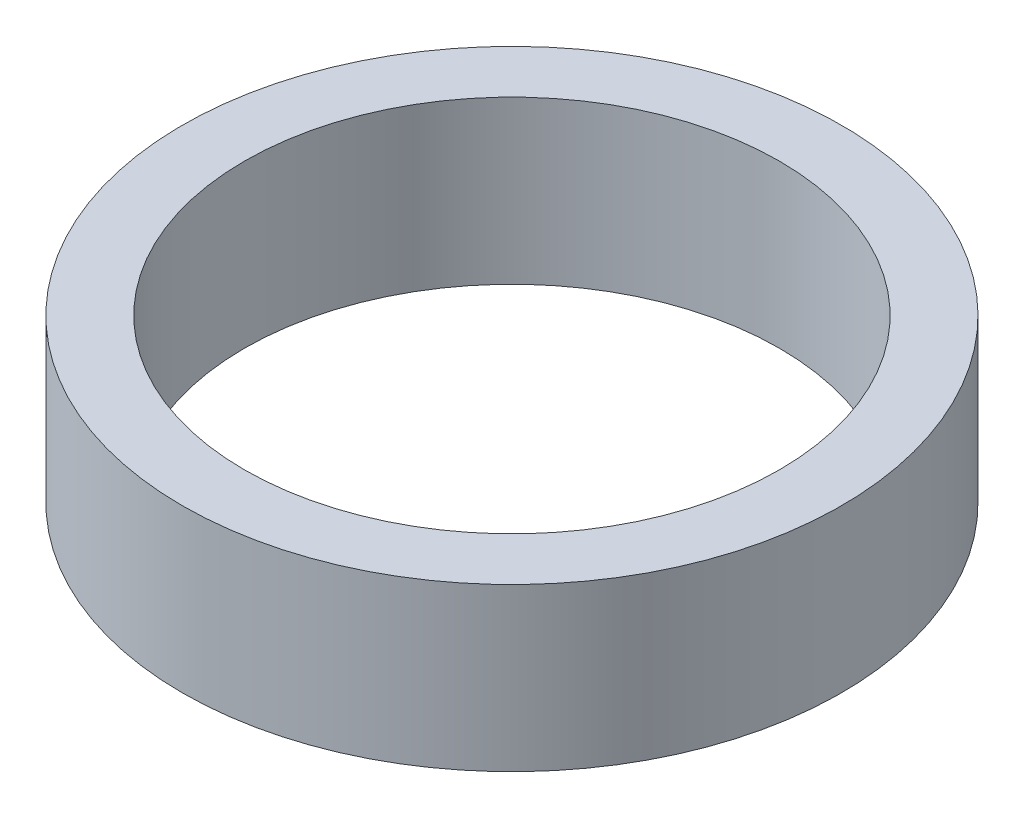
ISO-10303-21;
HEADER;
FILE_DESCRIPTION(('STEP AP214'),'2;1');
FILE_NAME('part.step','',(''),(''),'','','');
FILE_SCHEMA(('AUTOMOTIVE_DESIGN { 1 0 10303 214 1 1 1 1 }'));
ENDSEC;
DATA;
#1=APPLICATION_CONTEXT('core data for automotive mechanical design processes');
#2=APPLICATION_PROTOCOL_DEFINITION('international standard','automotive_design',2000,#1);
#3=PRODUCT_CONTEXT('',#1,'mechanical');
#4=PRODUCT('Part','Part','',(#3));
#5=PRODUCT_RELATED_PRODUCT_CATEGORY('part','',(#4));
#6=PRODUCT_DEFINITION_FORMATION('','',#4);
#7=PRODUCT_DEFINITION_CONTEXT('part definition',#1,'design');
#8=PRODUCT_DEFINITION('design','',#6,#7);
#9=PRODUCT_DEFINITION_SHAPE('','',#8);
#10=(LENGTH_UNIT() NAMED_UNIT(*) SI_UNIT(.MILLI.,.METRE.));
#11=(NAMED_UNIT(*) PLANE_ANGLE_UNIT() SI_UNIT($,.RADIAN.));
#12=(NAMED_UNIT(*) SI_UNIT($,.STERADIAN.) SOLID_ANGLE_UNIT());
#13=UNCERTAINTY_MEASURE_WITH_UNIT(LENGTH_MEASURE(1.E-05),#10,'distance_accuracy_value','');
#14=(GEOMETRIC_REPRESENTATION_CONTEXT(3) GLOBAL_UNCERTAINTY_ASSIGNED_CONTEXT((#13)) GLOBAL_UNIT_ASSIGNED_CONTEXT((#10,
#11,#12)) REPRESENTATION_CONTEXT('',''));
#15=CARTESIAN_POINT('',(0.,0.,0.));
#16=DIRECTION('',(0.,0.,1.));
#17=DIRECTION('',(1.,0.,0.));
#18=AXIS2_PLACEMENT_3D('',#15,#16,#17);
#19=CARTESIAN_POINT('',(0.,3.,0.));
#20=DIRECTION('',(0.,1.,0.));
#21=DIRECTION('',(0.,0.,1.));
#22=AXIS2_PLACEMENT_3D('',#19,#20,#21);
#23=PLANE('',#22);
#24=CARTESIAN_POINT('',(0.,3.,0.));
#25=DIRECTION('',(0.,1.,0.));
#26=DIRECTION('',(0.,0.,1.));
#27=AXIS2_PLACEMENT_3D('',#24,#25,#26);
#28=CIRCLE('',#27,6.1);
#29=CARTESIAN_POINT('',(0.,3.,6.1));
#30=VERTEX_POINT('',#29);
#31=EDGE_CURVE('E10',#30,#30,#28,.T.);
#32=ORIENTED_EDGE('',*,*,#31,.T.);
#33=EDGE_LOOP('',(#32));
#34=FACE_BOUND('',#33,.T.);
#35=CARTESIAN_POINT('',(0.,3.,0.));
#36=DIRECTION('',(0.,1.,0.));
#37=DIRECTION('',(0.,0.,1.));
#38=AXIS2_PLACEMENT_3D('',#35,#36,#37);
#39=CIRCLE('',#38,4.95);
#40=CARTESIAN_POINT('',(0.,3.,4.95));
#41=VERTEX_POINT('',#40);
#42=EDGE_CURVE('E42',#41,#41,#39,.T.);
#43=ORIENTED_EDGE('',*,*,#42,.F.);
#44=EDGE_LOOP('',(#43));
#45=FACE_BOUND('',#44,.T.);
#46=ADVANCED_FACE('F31',(#34,#45),#23,.T.);
#47=CARTESIAN_POINT('',(0.,0.,0.));
#48=DIRECTION('',(0.,1.,0.));
#49=DIRECTION('',(0.,0.,1.));
#50=AXIS2_PLACEMENT_3D('',#47,#48,#49);
#51=PLANE('',#50);
#52=CARTESIAN_POINT('',(0.,0.,0.));
#53=DIRECTION('',(0.,1.,0.));
#54=DIRECTION('',(0.,0.,1.));
#55=AXIS2_PLACEMENT_3D('',#52,#53,#54);
#56=CIRCLE('',#55,6.1);
#57=CARTESIAN_POINT('',(0.,0.,6.1));
#58=VERTEX_POINT('',#57);
#59=EDGE_CURVE('E35',#58,#58,#56,.T.);
#60=ORIENTED_EDGE('',*,*,#59,.F.);
#61=EDGE_LOOP('',(#60));
#62=FACE_BOUND('',#61,.T.);
#63=CARTESIAN_POINT('',(0.,0.,0.));
#64=DIRECTION('',(0.,1.,0.));
#65=DIRECTION('',(0.,0.,1.));
#66=AXIS2_PLACEMENT_3D('',#63,#64,#65);
#67=CIRCLE('',#66,4.95);
#68=CARTESIAN_POINT('',(0.,0.,4.95));
#69=VERTEX_POINT('',#68);
#70=EDGE_CURVE('E44',#69,#69,#67,.T.);
#71=ORIENTED_EDGE('',*,*,#70,.T.);
#72=EDGE_LOOP('',(#71));
#73=FACE_BOUND('',#72,.T.);
#74=ADVANCED_FACE('F54',(#62,#73),#51,.F.);
#75=CARTESIAN_POINT('',(0.,3.,0.));
#76=DIRECTION('',(0.,-1.,0.));
#77=DIRECTION('',(0.,0.,-1.));
#78=AXIS2_PLACEMENT_3D('',#75,#76,#77);
#79=CYLINDRICAL_SURFACE('',#78,6.1);
#80=ORIENTED_EDGE('',*,*,#31,.F.);
#81=EDGE_LOOP('',(#80));
#82=FACE_BOUND('',#81,.T.);
#83=ORIENTED_EDGE('',*,*,#59,.T.);
#84=EDGE_LOOP('',(#83));
#85=FACE_BOUND('',#84,.T.);
#86=ADVANCED_FACE('F33',(#82,#85),#79,.T.);
#87=CARTESIAN_POINT('',(0.,3.,0.));
#88=DIRECTION('',(0.,-1.,0.));
#89=DIRECTION('',(0.,0.,-1.));
#90=AXIS2_PLACEMENT_3D('',#87,#88,#89);
#91=CYLINDRICAL_SURFACE('',#90,4.95);
#92=ORIENTED_EDGE('',*,*,#42,.T.);
#93=EDGE_LOOP('',(#92));
#94=FACE_BOUND('',#93,.T.);
#95=ORIENTED_EDGE('',*,*,#70,.F.);
#96=EDGE_LOOP('',(#95));
#97=FACE_BOUND('',#96,.T.);
#98=ADVANCED_FACE('F50',(#94,#97),#91,.F.);
#99=CLOSED_SHELL('',(#46,#74,#86,#98));
#100=MANIFOLD_SOLID_BREP('B2',#99);
#101=ADVANCED_BREP_SHAPE_REPRESENTATION('',(#18,#100),#14);
#102=SHAPE_DEFINITION_REPRESENTATION(#9,#101);
ENDSEC;
END-ISO-10303-21;
